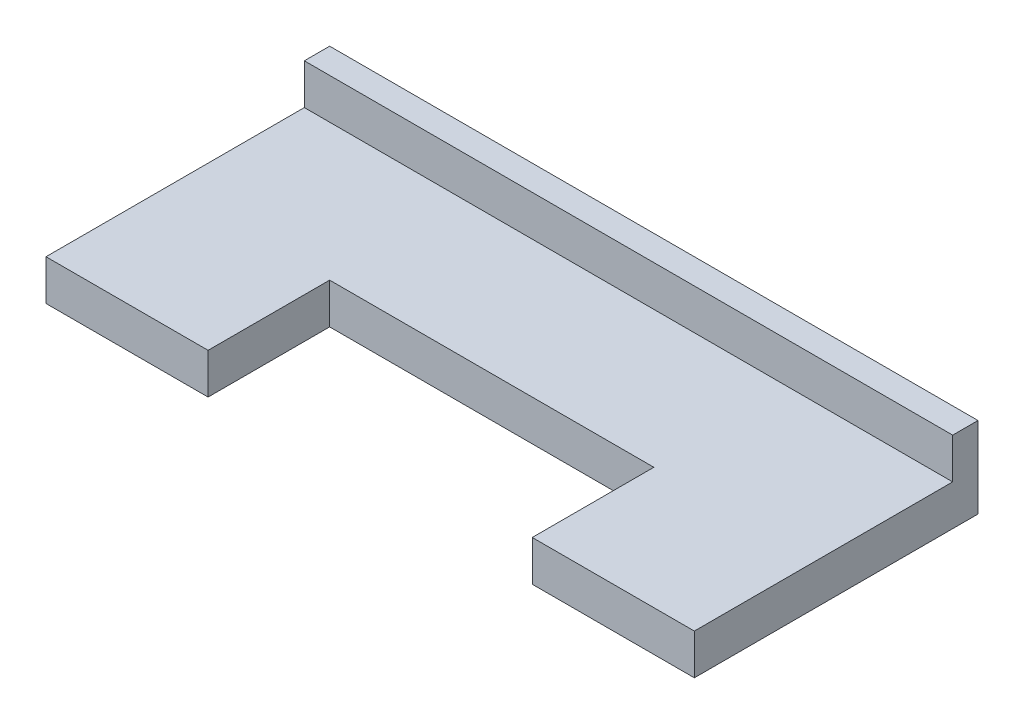
ISO-10303-21;
HEADER;
FILE_DESCRIPTION(('STEP AP214'),'2;1');
FILE_NAME('part.step','',(''),(''),'','','');
FILE_SCHEMA(('AUTOMOTIVE_DESIGN { 1 0 10303 214 1 1 1 1 }'));
ENDSEC;
DATA;
#1=APPLICATION_CONTEXT('core data for automotive mechanical design processes');
#2=APPLICATION_PROTOCOL_DEFINITION('international standard','automotive_design',2000,#1);
#3=PRODUCT_CONTEXT('',#1,'mechanical');
#4=PRODUCT('Part','Part','',(#3));
#5=PRODUCT_RELATED_PRODUCT_CATEGORY('part','',(#4));
#6=PRODUCT_DEFINITION_FORMATION('','',#4);
#7=PRODUCT_DEFINITION_CONTEXT('part definition',#1,'design');
#8=PRODUCT_DEFINITION('design','',#6,#7);
#9=PRODUCT_DEFINITION_SHAPE('','',#8);
#10=(LENGTH_UNIT() NAMED_UNIT(*) SI_UNIT(.MILLI.,.METRE.));
#11=(NAMED_UNIT(*) PLANE_ANGLE_UNIT() SI_UNIT($,.RADIAN.));
#12=(NAMED_UNIT(*) SI_UNIT($,.STERADIAN.) SOLID_ANGLE_UNIT());
#13=UNCERTAINTY_MEASURE_WITH_UNIT(LENGTH_MEASURE(1.E-05),#10,'distance_accuracy_value','');
#14=(GEOMETRIC_REPRESENTATION_CONTEXT(3) GLOBAL_UNCERTAINTY_ASSIGNED_CONTEXT((#13)) GLOBAL_UNIT_ASSIGNED_CONTEXT((#10,
#11,#12)) REPRESENTATION_CONTEXT('',''));
#15=CARTESIAN_POINT('',(0.,0.,0.));
#16=DIRECTION('',(0.,0.,1.));
#17=DIRECTION('',(1.,0.,0.));
#18=AXIS2_PLACEMENT_3D('',#15,#16,#17);
#19=CARTESIAN_POINT('',(0.,1.27,0.));
#20=DIRECTION('',(0.,-1.,0.));
#21=DIRECTION('',(0.,0.,-1.));
#22=AXIS2_PLACEMENT_3D('',#19,#20,#21);
#23=PLANE('',#22);
#24=DIRECTION('',(-1.,0.,0.));
#25=VECTOR('',#24,1.);
#26=CARTESIAN_POINT('',(10.16,1.27,3.81));
#27=LINE('',#26,#25);
#28=CARTESIAN_POINT('',(10.16,1.27,3.81));
#29=VERTEX_POINT('',#28);
#30=CARTESIAN_POINT('',(5.08,1.27,3.81));
#31=VERTEX_POINT('',#30);
#32=EDGE_CURVE('E56',#29,#31,#27,.T.);
#33=ORIENTED_EDGE('',*,*,#32,.F.);
#34=DIRECTION('',(0.,0.,-1.));
#35=VECTOR('',#34,1.);
#36=CARTESIAN_POINT('',(10.16,1.27,5.08));
#37=LINE('',#36,#35);
#38=CARTESIAN_POINT('',(10.16,1.27,-4.28625));
#39=VERTEX_POINT('',#38);
#40=EDGE_CURVE('E119',#29,#39,#37,.T.);
#41=ORIENTED_EDGE('',*,*,#40,.T.);
#42=DIRECTION('',(1.,0.,0.));
#43=VECTOR('',#42,1.);
#44=CARTESIAN_POINT('',(-10.16,1.27,-4.28625));
#45=LINE('',#44,#43);
#46=CARTESIAN_POINT('',(-10.16,1.27,-4.28625));
#47=VERTEX_POINT('',#46);
#48=EDGE_CURVE('E173',#47,#39,#45,.T.);
#49=ORIENTED_EDGE('',*,*,#48,.F.);
#50=DIRECTION('',(0.,0.,1.));
#51=VECTOR('',#50,1.);
#52=CARTESIAN_POINT('',(-10.16,1.27,5.08));
#53=LINE('',#52,#51);
#54=CARTESIAN_POINT('',(-10.16,1.27,3.81));
#55=VERTEX_POINT('',#54);
#56=EDGE_CURVE('E129',#47,#55,#53,.T.);
#57=ORIENTED_EDGE('',*,*,#56,.T.);
#58=DIRECTION('',(-1.,0.,0.));
#59=VECTOR('',#58,1.);
#60=CARTESIAN_POINT('',(-5.08,1.27,3.81));
#61=LINE('',#60,#59);
#62=CARTESIAN_POINT('',(-5.08,1.27,3.81));
#63=VERTEX_POINT('',#62);
#64=EDGE_CURVE('E115',#63,#55,#61,.T.);
#65=ORIENTED_EDGE('',*,*,#64,.F.);
#66=DIRECTION('',(0.,0.,1.));
#67=VECTOR('',#66,1.);
#68=CARTESIAN_POINT('',(-5.08,1.27,5.08));
#69=LINE('',#68,#67);
#70=CARTESIAN_POINT('',(-5.08,1.27,0.));
#71=VERTEX_POINT('',#70);
#72=EDGE_CURVE('E185',#71,#63,#69,.T.);
#73=ORIENTED_EDGE('',*,*,#72,.F.);
#74=DIRECTION('',(-1.,0.,0.));
#75=VECTOR('',#74,1.);
#76=CARTESIAN_POINT('',(-5.08,1.27,0.));
#77=LINE('',#76,#75);
#78=CARTESIAN_POINT('',(5.08,1.27,0.));
#79=VERTEX_POINT('',#78);
#80=EDGE_CURVE('E188',#79,#71,#77,.T.);
#81=ORIENTED_EDGE('',*,*,#80,.F.);
#82=DIRECTION('',(0.,0.,-1.));
#83=VECTOR('',#82,1.);
#84=CARTESIAN_POINT('',(5.08,1.27,5.08));
#85=LINE('',#84,#83);
#86=EDGE_CURVE('E122',#31,#79,#85,.T.);
#87=ORIENTED_EDGE('',*,*,#86,.F.);
#88=EDGE_LOOP('',(#33,#41,#49,#57,#65,#73,#81,#87));
#89=FACE_BOUND('',#88,.T.);
#90=ADVANCED_FACE('F33',(#89),#23,.F.);
#91=CARTESIAN_POINT('',(10.16,1.27,5.08));
#92=DIRECTION('',(-1.,0.,0.));
#93=DIRECTION('',(0.,0.,1.));
#94=AXIS2_PLACEMENT_3D('',#91,#92,#93);
#95=PLANE('',#94);
#96=DIRECTION('',(0.,1.,0.));
#97=VECTOR('',#96,1.);
#98=CARTESIAN_POINT('',(10.16,0.,3.81));
#99=LINE('',#98,#97);
#100=CARTESIAN_POINT('',(10.16,0.,3.81));
#101=VERTEX_POINT('',#100);
#102=EDGE_CURVE('E108',#101,#29,#99,.T.);
#103=ORIENTED_EDGE('',*,*,#102,.F.);
#104=DIRECTION('',(0.,0.,-1.));
#105=VECTOR('',#104,1.);
#106=CARTESIAN_POINT('',(10.16,0.,5.08));
#107=LINE('',#106,#105);
#108=CARTESIAN_POINT('',(10.16,0.,-5.08));
#109=VERTEX_POINT('',#108);
#110=EDGE_CURVE('E141',#101,#109,#107,.T.);
#111=ORIENTED_EDGE('',*,*,#110,.T.);
#112=DIRECTION('',(0.,-1.,0.));
#113=VECTOR('',#112,1.);
#114=CARTESIAN_POINT('',(10.16,1.27,-5.08));
#115=LINE('',#114,#113);
#116=CARTESIAN_POINT('',(10.16,2.54,-5.08));
#117=VERTEX_POINT('',#116);
#118=EDGE_CURVE('E11',#117,#109,#115,.T.);
#119=ORIENTED_EDGE('',*,*,#118,.F.);
#120=DIRECTION('',(0.,0.,-1.));
#121=VECTOR('',#120,1.);
#122=CARTESIAN_POINT('',(10.16,2.54,-5.08));
#123=LINE('',#122,#121);
#124=CARTESIAN_POINT('',(10.16,2.54,-4.28625));
#125=VERTEX_POINT('',#124);
#126=EDGE_CURVE('E175',#125,#117,#123,.T.);
#127=ORIENTED_EDGE('',*,*,#126,.F.);
#128=DIRECTION('',(0.,-1.,0.));
#129=VECTOR('',#128,1.);
#130=CARTESIAN_POINT('',(10.16,2.54,-4.28625));
#131=LINE('',#130,#129);
#132=EDGE_CURVE('E128',#125,#39,#131,.T.);
#133=ORIENTED_EDGE('',*,*,#132,.T.);
#134=ORIENTED_EDGE('',*,*,#40,.F.);
#135=EDGE_LOOP('',(#103,#111,#119,#127,#133,#134));
#136=FACE_BOUND('',#135,.T.);
#137=ADVANCED_FACE('F35',(#136),#95,.F.);
#138=CARTESIAN_POINT('',(-10.16,1.27,5.08));
#139=DIRECTION('',(1.,0.,0.));
#140=DIRECTION('',(0.,0.,-1.));
#141=AXIS2_PLACEMENT_3D('',#138,#139,#140);
#142=PLANE('',#141);
#143=DIRECTION('',(0.,-1.,0.));
#144=VECTOR('',#143,1.);
#145=CARTESIAN_POINT('',(-10.16,1.27,3.81));
#146=LINE('',#145,#144);
#147=CARTESIAN_POINT('',(-10.16,0.,3.81));
#148=VERTEX_POINT('',#147);
#149=EDGE_CURVE('E164',#55,#148,#146,.T.);
#150=ORIENTED_EDGE('',*,*,#149,.F.);
#151=ORIENTED_EDGE('',*,*,#56,.F.);
#152=DIRECTION('',(0.,-1.,0.));
#153=VECTOR('',#152,1.);
#154=CARTESIAN_POINT('',(-10.16,2.54,-4.28625));
#155=LINE('',#154,#153);
#156=CARTESIAN_POINT('',(-10.16,2.54,-4.28625));
#157=VERTEX_POINT('',#156);
#158=EDGE_CURVE('E182',#157,#47,#155,.T.);
#159=ORIENTED_EDGE('',*,*,#158,.F.);
#160=DIRECTION('',(0.,0.,1.));
#161=VECTOR('',#160,1.);
#162=CARTESIAN_POINT('',(-10.16,2.54,-5.08));
#163=LINE('',#162,#161);
#164=CARTESIAN_POINT('',(-10.16,2.54,-5.08));
#165=VERTEX_POINT('',#164);
#166=EDGE_CURVE('E152',#165,#157,#163,.T.);
#167=ORIENTED_EDGE('',*,*,#166,.F.);
#168=DIRECTION('',(0.,-1.,0.));
#169=VECTOR('',#168,1.);
#170=CARTESIAN_POINT('',(-10.16,1.27,-5.08));
#171=LINE('',#170,#169);
#172=CARTESIAN_POINT('',(-10.16,0.,-5.08));
#173=VERTEX_POINT('',#172);
#174=EDGE_CURVE('E41',#165,#173,#171,.T.);
#175=ORIENTED_EDGE('',*,*,#174,.T.);
#176=DIRECTION('',(0.,0.,1.));
#177=VECTOR('',#176,1.);
#178=CARTESIAN_POINT('',(-10.16,0.,5.08));
#179=LINE('',#178,#177);
#180=EDGE_CURVE('E130',#173,#148,#179,.T.);
#181=ORIENTED_EDGE('',*,*,#180,.T.);
#182=EDGE_LOOP('',(#150,#151,#159,#167,#175,#181));
#183=FACE_BOUND('',#182,.T.);
#184=ADVANCED_FACE('F149',(#183),#142,.F.);
#185=CARTESIAN_POINT('',(0.,0.,0.));
#186=DIRECTION('',(0.,-1.,0.));
#187=DIRECTION('',(0.,0.,-1.));
#188=AXIS2_PLACEMENT_3D('',#185,#186,#187);
#189=PLANE('',#188);
#190=ORIENTED_EDGE('',*,*,#110,.F.);
#191=DIRECTION('',(1.,0.,0.));
#192=VECTOR('',#191,1.);
#193=CARTESIAN_POINT('',(5.08,0.,3.81));
#194=LINE('',#193,#192);
#195=CARTESIAN_POINT('',(5.08,0.,3.81));
#196=VERTEX_POINT('',#195);
#197=EDGE_CURVE('E111',#196,#101,#194,.T.);
#198=ORIENTED_EDGE('',*,*,#197,.F.);
#199=DIRECTION('',(0.,0.,-1.));
#200=VECTOR('',#199,1.);
#201=CARTESIAN_POINT('',(5.08,0.,5.08));
#202=LINE('',#201,#200);
#203=CARTESIAN_POINT('',(5.08,0.,0.));
#204=VERTEX_POINT('',#203);
#205=EDGE_CURVE('E187',#196,#204,#202,.T.);
#206=ORIENTED_EDGE('',*,*,#205,.T.);
#207=DIRECTION('',(-1.,0.,0.));
#208=VECTOR('',#207,1.);
#209=CARTESIAN_POINT('',(-5.08,0.,0.));
#210=LINE('',#209,#208);
#211=CARTESIAN_POINT('',(-5.08,0.,0.));
#212=VERTEX_POINT('',#211);
#213=EDGE_CURVE('E190',#204,#212,#210,.T.);
#214=ORIENTED_EDGE('',*,*,#213,.T.);
#215=DIRECTION('',(0.,0.,1.));
#216=VECTOR('',#215,1.);
#217=CARTESIAN_POINT('',(-5.08,0.,5.08));
#218=LINE('',#217,#216);
#219=CARTESIAN_POINT('',(-5.08,0.,3.81));
#220=VERTEX_POINT('',#219);
#221=EDGE_CURVE('E162',#212,#220,#218,.T.);
#222=ORIENTED_EDGE('',*,*,#221,.T.);
#223=DIRECTION('',(1.,0.,0.));
#224=VECTOR('',#223,1.);
#225=CARTESIAN_POINT('',(-10.16,0.,3.81));
#226=LINE('',#225,#224);
#227=EDGE_CURVE('E48',#148,#220,#226,.T.);
#228=ORIENTED_EDGE('',*,*,#227,.F.);
#229=ORIENTED_EDGE('',*,*,#180,.F.);
#230=DIRECTION('',(-1.,0.,0.));
#231=VECTOR('',#230,1.);
#232=CARTESIAN_POINT('',(-10.16,0.,-5.08));
#233=LINE('',#232,#231);
#234=EDGE_CURVE('E135',#109,#173,#233,.T.);
#235=ORIENTED_EDGE('',*,*,#234,.F.);
#236=EDGE_LOOP('',(#190,#198,#206,#214,#222,#228,#229,#235));
#237=FACE_BOUND('',#236,.T.);
#238=ADVANCED_FACE('F158',(#237),#189,.T.);
#239=CARTESIAN_POINT('',(-5.08,0.,5.08));
#240=DIRECTION('',(-1.,0.,0.));
#241=DIRECTION('',(0.,0.,1.));
#242=AXIS2_PLACEMENT_3D('',#239,#240,#241);
#243=PLANE('',#242);
#244=DIRECTION('',(0.,1.,0.));
#245=VECTOR('',#244,1.);
#246=CARTESIAN_POINT('',(-5.08,0.,3.81));
#247=LINE('',#246,#245);
#248=EDGE_CURVE('E163',#220,#63,#247,.T.);
#249=ORIENTED_EDGE('',*,*,#248,.F.);
#250=ORIENTED_EDGE('',*,*,#221,.F.);
#251=DIRECTION('',(0.,1.,0.));
#252=VECTOR('',#251,1.);
#253=CARTESIAN_POINT('',(-5.08,0.,0.));
#254=LINE('',#253,#252);
#255=EDGE_CURVE('E143',#212,#71,#254,.T.);
#256=ORIENTED_EDGE('',*,*,#255,.T.);
#257=ORIENTED_EDGE('',*,*,#72,.T.);
#258=EDGE_LOOP('',(#249,#250,#256,#257));
#259=FACE_BOUND('',#258,.T.);
#260=ADVANCED_FACE('F206',(#259),#243,.F.);
#261=CARTESIAN_POINT('',(5.08,0.,5.08));
#262=DIRECTION('',(1.,0.,0.));
#263=DIRECTION('',(0.,0.,-1.));
#264=AXIS2_PLACEMENT_3D('',#261,#262,#263);
#265=PLANE('',#264);
#266=DIRECTION('',(0.,-1.,0.));
#267=VECTOR('',#266,1.);
#268=CARTESIAN_POINT('',(5.08,1.27,3.81));
#269=LINE('',#268,#267);
#270=EDGE_CURVE('E123',#31,#196,#269,.T.);
#271=ORIENTED_EDGE('',*,*,#270,.F.);
#272=ORIENTED_EDGE('',*,*,#86,.T.);
#273=DIRECTION('',(0.,1.,0.));
#274=VECTOR('',#273,1.);
#275=CARTESIAN_POINT('',(5.08,0.,0.));
#276=LINE('',#275,#274);
#277=EDGE_CURVE('E138',#204,#79,#276,.T.);
#278=ORIENTED_EDGE('',*,*,#277,.F.);
#279=ORIENTED_EDGE('',*,*,#205,.F.);
#280=EDGE_LOOP('',(#271,#272,#278,#279));
#281=FACE_BOUND('',#280,.T.);
#282=ADVANCED_FACE('F214',(#281),#265,.F.);
#283=CARTESIAN_POINT('',(-10.16,1.27,-5.08));
#284=DIRECTION('',(0.,0.,1.));
#285=DIRECTION('',(1.,0.,0.));
#286=AXIS2_PLACEMENT_3D('',#283,#284,#285);
#287=PLANE('',#286);
#288=ORIENTED_EDGE('',*,*,#234,.T.);
#289=ORIENTED_EDGE('',*,*,#174,.F.);
#290=DIRECTION('',(-1.,0.,0.));
#291=VECTOR('',#290,1.);
#292=CARTESIAN_POINT('',(-10.16,2.54,-5.08));
#293=LINE('',#292,#291);
#294=EDGE_CURVE('E178',#117,#165,#293,.T.);
#295=ORIENTED_EDGE('',*,*,#294,.F.);
#296=ORIENTED_EDGE('',*,*,#118,.T.);
#297=EDGE_LOOP('',(#288,#289,#295,#296));
#298=FACE_BOUND('',#297,.T.);
#299=ADVANCED_FACE('F213',(#298),#287,.F.);
#300=CARTESIAN_POINT('',(-5.08,0.,0.));
#301=DIRECTION('',(0.,0.,-1.));
#302=DIRECTION('',(-1.,0.,0.));
#303=AXIS2_PLACEMENT_3D('',#300,#301,#302);
#304=PLANE('',#303);
#305=ORIENTED_EDGE('',*,*,#80,.T.);
#306=ORIENTED_EDGE('',*,*,#255,.F.);
#307=ORIENTED_EDGE('',*,*,#213,.F.);
#308=ORIENTED_EDGE('',*,*,#277,.T.);
#309=EDGE_LOOP('',(#305,#306,#307,#308));
#310=FACE_BOUND('',#309,.T.);
#311=ADVANCED_FACE('F201',(#310),#304,.F.);
#312=CARTESIAN_POINT('',(-10.16,2.54,-4.28625));
#313=DIRECTION('',(0.,0.,-1.));
#314=DIRECTION('',(-1.,0.,0.));
#315=AXIS2_PLACEMENT_3D('',#312,#313,#314);
#316=PLANE('',#315);
#317=ORIENTED_EDGE('',*,*,#48,.T.);
#318=ORIENTED_EDGE('',*,*,#132,.F.);
#319=DIRECTION('',(1.,0.,0.));
#320=VECTOR('',#319,1.);
#321=CARTESIAN_POINT('',(-10.16,2.54,-4.28625));
#322=LINE('',#321,#320);
#323=EDGE_CURVE('E172',#157,#125,#322,.T.);
#324=ORIENTED_EDGE('',*,*,#323,.F.);
#325=ORIENTED_EDGE('',*,*,#158,.T.);
#326=EDGE_LOOP('',(#317,#318,#324,#325));
#327=FACE_BOUND('',#326,.T.);
#328=ADVANCED_FACE('F210',(#327),#316,.F.);
#329=CARTESIAN_POINT('',(0.,2.54,0.));
#330=DIRECTION('',(0.,1.,0.));
#331=DIRECTION('',(0.,0.,1.));
#332=AXIS2_PLACEMENT_3D('',#329,#330,#331);
#333=PLANE('',#332);
#334=ORIENTED_EDGE('',*,*,#166,.T.);
#335=ORIENTED_EDGE('',*,*,#323,.T.);
#336=ORIENTED_EDGE('',*,*,#126,.T.);
#337=ORIENTED_EDGE('',*,*,#294,.T.);
#338=EDGE_LOOP('',(#334,#335,#336,#337));
#339=FACE_BOUND('',#338,.T.);
#340=ADVANCED_FACE('F212',(#339),#333,.T.);
#341=CARTESIAN_POINT('',(0.,0.,3.81));
#342=DIRECTION('',(0.,0.,1.));
#343=DIRECTION('',(1.,0.,0.));
#344=AXIS2_PLACEMENT_3D('',#341,#342,#343);
#345=PLANE('',#344);
#346=ORIENTED_EDGE('',*,*,#102,.T.);
#347=ORIENTED_EDGE('',*,*,#32,.T.);
#348=ORIENTED_EDGE('',*,*,#270,.T.);
#349=ORIENTED_EDGE('',*,*,#197,.T.);
#350=EDGE_LOOP('',(#346,#347,#348,#349));
#351=FACE_BOUND('',#350,.T.);
#352=ADVANCED_FACE('F109',(#351),#345,.T.);
#353=CARTESIAN_POINT('',(0.,0.,3.81));
#354=DIRECTION('',(0.,0.,1.));
#355=DIRECTION('',(1.,0.,0.));
#356=AXIS2_PLACEMENT_3D('',#353,#354,#355);
#357=PLANE('',#356);
#358=ORIENTED_EDGE('',*,*,#149,.T.);
#359=ORIENTED_EDGE('',*,*,#227,.T.);
#360=ORIENTED_EDGE('',*,*,#248,.T.);
#361=ORIENTED_EDGE('',*,*,#64,.T.);
#362=EDGE_LOOP('',(#358,#359,#360,#361));
#363=FACE_BOUND('',#362,.T.);
#364=ADVANCED_FACE('F207',(#363),#357,.T.);
#365=CLOSED_SHELL('',(#90,#137,#184,#238,#260,#282,#299,#311,#328,#340,#352,#364));
#366=MANIFOLD_SOLID_BREP('B2',#365);
#367=ADVANCED_BREP_SHAPE_REPRESENTATION('',(#18,#366),#14);
#368=SHAPE_DEFINITION_REPRESENTATION(#9,#367);
ENDSEC;
END-ISO-10303-21;
